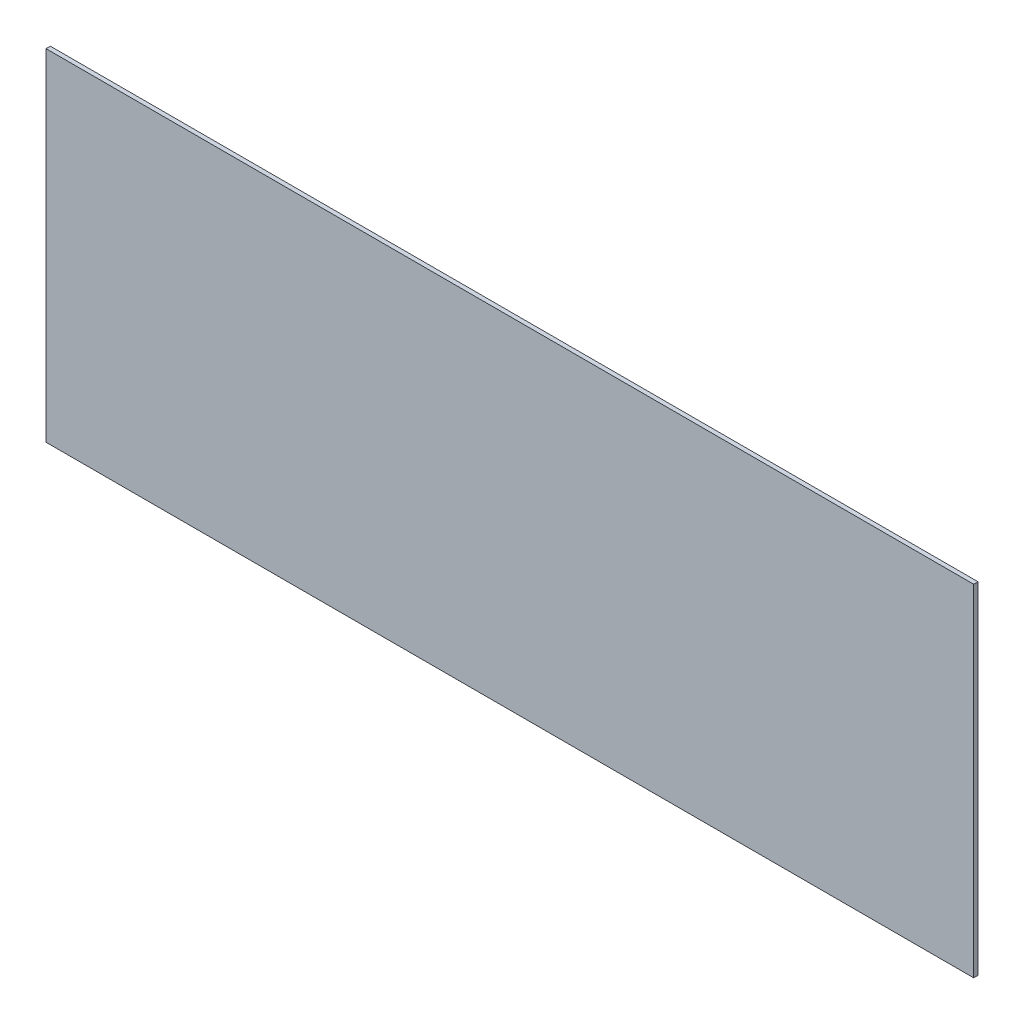
ISO-10303-21;
HEADER;
FILE_DESCRIPTION(('STEP AP214'),'2;1');
FILE_NAME('part.step','',(''),(''),'','','');
FILE_SCHEMA(('AUTOMOTIVE_DESIGN { 1 0 10303 214 1 1 1 1 }'));
ENDSEC;
DATA;
#1=APPLICATION_CONTEXT('core data for automotive mechanical design processes');
#2=APPLICATION_PROTOCOL_DEFINITION('international standard','automotive_design',2000,#1);
#3=PRODUCT_CONTEXT('',#1,'mechanical');
#4=PRODUCT('Part','Part','',(#3));
#5=PRODUCT_RELATED_PRODUCT_CATEGORY('part','',(#4));
#6=PRODUCT_DEFINITION_FORMATION('','',#4);
#7=PRODUCT_DEFINITION_CONTEXT('part definition',#1,'design');
#8=PRODUCT_DEFINITION('design','',#6,#7);
#9=PRODUCT_DEFINITION_SHAPE('','',#8);
#10=(LENGTH_UNIT() NAMED_UNIT(*) SI_UNIT(.MILLI.,.METRE.));
#11=(NAMED_UNIT(*) PLANE_ANGLE_UNIT() SI_UNIT($,.RADIAN.));
#12=(NAMED_UNIT(*) SI_UNIT($,.STERADIAN.) SOLID_ANGLE_UNIT());
#13=UNCERTAINTY_MEASURE_WITH_UNIT(LENGTH_MEASURE(1.E-05),#10,'distance_accuracy_value','');
#14=(GEOMETRIC_REPRESENTATION_CONTEXT(3) GLOBAL_UNCERTAINTY_ASSIGNED_CONTEXT((#13)) GLOBAL_UNIT_ASSIGNED_CONTEXT((#10,
#11,#12)) REPRESENTATION_CONTEXT('',''));
#15=CARTESIAN_POINT('',(0.,0.,0.));
#16=DIRECTION('',(0.,0.,1.));
#17=DIRECTION('',(1.,0.,0.));
#18=AXIS2_PLACEMENT_3D('',#15,#16,#17);
#19=CARTESIAN_POINT('',(-9.52499999999953,-19.0035951574495,2.));
#20=DIRECTION('',(1.,0.,0.));
#21=DIRECTION('',(0.,1.,0.));
#22=AXIS2_PLACEMENT_3D('',#19,#20,#21);
#23=PLANE('',#22);
#24=DIRECTION('',(0.,-1.,0.));
#25=VECTOR('',#24,1.);
#26=CARTESIAN_POINT('',(-9.52499999999953,-19.0035951574495,0.));
#27=LINE('',#26,#25);
#28=CARTESIAN_POINT('',(-9.52500000000003,139.00359515745,0.));
#29=VERTEX_POINT('',#28);
#30=CARTESIAN_POINT('',(-9.52499999999953,-19.0035951574495,0.));
#31=VERTEX_POINT('',#30);
#32=EDGE_CURVE('E95',#29,#31,#27,.T.);
#33=ORIENTED_EDGE('',*,*,#32,.T.);
#34=DIRECTION('',(0.,0.,-1.));
#35=VECTOR('',#34,1.);
#36=CARTESIAN_POINT('',(-9.52499999999953,-19.0035951574495,2.));
#37=LINE('',#36,#35);
#38=CARTESIAN_POINT('',(-9.52499999999953,-19.0035951574495,2.));
#39=VERTEX_POINT('',#38);
#40=EDGE_CURVE('E11',#39,#31,#37,.T.);
#41=ORIENTED_EDGE('',*,*,#40,.F.);
#42=DIRECTION('',(0.,-1.,0.));
#43=VECTOR('',#42,1.);
#44=CARTESIAN_POINT('',(-9.52499999999953,-19.0035951574495,2.));
#45=LINE('',#44,#43);
#46=CARTESIAN_POINT('',(-9.52500000000003,139.00359515745,2.));
#47=VERTEX_POINT('',#46);
#48=EDGE_CURVE('E83',#47,#39,#45,.T.);
#49=ORIENTED_EDGE('',*,*,#48,.F.);
#50=DIRECTION('',(0.,0.,-1.));
#51=VECTOR('',#50,1.);
#52=CARTESIAN_POINT('',(-9.52500000000003,139.00359515745,2.));
#53=LINE('',#52,#51);
#54=EDGE_CURVE('E91',#47,#29,#53,.T.);
#55=ORIENTED_EDGE('',*,*,#54,.T.);
#56=EDGE_LOOP('',(#33,#41,#49,#55));
#57=FACE_BOUND('',#56,.T.);
#58=ADVANCED_FACE('F32',(#57),#23,.F.);
#59=CARTESIAN_POINT('',(420.475,-19.0035951574497,2.));
#60=DIRECTION('',(0.,1.,0.));
#61=DIRECTION('',(-1.,0.,0.));
#62=AXIS2_PLACEMENT_3D('',#59,#60,#61);
#63=PLANE('',#62);
#64=DIRECTION('',(1.,0.,0.));
#65=VECTOR('',#64,1.);
#66=CARTESIAN_POINT('',(420.475,-19.0035951574497,0.));
#67=LINE('',#66,#65);
#68=CARTESIAN_POINT('',(420.475,-19.0035951574497,0.));
#69=VERTEX_POINT('',#68);
#70=EDGE_CURVE('E87',#31,#69,#67,.T.);
#71=ORIENTED_EDGE('',*,*,#70,.T.);
#72=DIRECTION('',(0.,0.,-1.));
#73=VECTOR('',#72,1.);
#74=CARTESIAN_POINT('',(420.475,-19.0035951574497,2.));
#75=LINE('',#74,#73);
#76=CARTESIAN_POINT('',(420.475,-19.0035951574497,2.));
#77=VERTEX_POINT('',#76);
#78=EDGE_CURVE('E40',#77,#69,#75,.T.);
#79=ORIENTED_EDGE('',*,*,#78,.F.);
#80=DIRECTION('',(1.,0.,0.));
#81=VECTOR('',#80,1.);
#82=CARTESIAN_POINT('',(420.475,-19.0035951574497,2.));
#83=LINE('',#82,#81);
#84=EDGE_CURVE('E78',#39,#77,#83,.T.);
#85=ORIENTED_EDGE('',*,*,#84,.F.);
#86=ORIENTED_EDGE('',*,*,#40,.T.);
#87=EDGE_LOOP('',(#71,#79,#85,#86));
#88=FACE_BOUND('',#87,.T.);
#89=ADVANCED_FACE('F86',(#88),#63,.F.);
#90=CARTESIAN_POINT('',(420.475,139.00359515745,2.));
#91=DIRECTION('',(-1.,0.,0.));
#92=DIRECTION('',(0.,-1.,0.));
#93=AXIS2_PLACEMENT_3D('',#90,#91,#92);
#94=PLANE('',#93);
#95=DIRECTION('',(0.,1.,0.));
#96=VECTOR('',#95,1.);
#97=CARTESIAN_POINT('',(420.475,139.00359515745,0.));
#98=LINE('',#97,#96);
#99=CARTESIAN_POINT('',(420.475,139.00359515745,0.));
#100=VERTEX_POINT('',#99);
#101=EDGE_CURVE('E65',#69,#100,#98,.T.);
#102=ORIENTED_EDGE('',*,*,#101,.T.);
#103=DIRECTION('',(0.,0.,-1.));
#104=VECTOR('',#103,1.);
#105=CARTESIAN_POINT('',(420.475,139.00359515745,2.));
#106=LINE('',#105,#104);
#107=CARTESIAN_POINT('',(420.475,139.00359515745,2.));
#108=VERTEX_POINT('',#107);
#109=EDGE_CURVE('E88',#108,#100,#106,.T.);
#110=ORIENTED_EDGE('',*,*,#109,.F.);
#111=DIRECTION('',(0.,1.,0.));
#112=VECTOR('',#111,1.);
#113=CARTESIAN_POINT('',(420.475,139.00359515745,2.));
#114=LINE('',#113,#112);
#115=EDGE_CURVE('E81',#77,#108,#114,.T.);
#116=ORIENTED_EDGE('',*,*,#115,.F.);
#117=ORIENTED_EDGE('',*,*,#78,.T.);
#118=EDGE_LOOP('',(#102,#110,#116,#117));
#119=FACE_BOUND('',#118,.T.);
#120=ADVANCED_FACE('F89',(#119),#94,.F.);
#121=CARTESIAN_POINT('',(-9.52500000000003,139.00359515745,2.));
#122=DIRECTION('',(0.,-1.,0.));
#123=DIRECTION('',(0.,0.,-1.));
#124=AXIS2_PLACEMENT_3D('',#121,#122,#123);
#125=PLANE('',#124);
#126=DIRECTION('',(-1.,0.,0.));
#127=VECTOR('',#126,1.);
#128=CARTESIAN_POINT('',(-9.52500000000003,139.00359515745,0.));
#129=LINE('',#128,#127);
#130=EDGE_CURVE('E71',#100,#29,#129,.T.);
#131=ORIENTED_EDGE('',*,*,#130,.T.);
#132=ORIENTED_EDGE('',*,*,#54,.F.);
#133=DIRECTION('',(-1.,0.,0.));
#134=VECTOR('',#133,1.);
#135=CARTESIAN_POINT('',(-9.52500000000003,139.00359515745,2.));
#136=LINE('',#135,#134);
#137=EDGE_CURVE('E48',#108,#47,#136,.T.);
#138=ORIENTED_EDGE('',*,*,#137,.F.);
#139=ORIENTED_EDGE('',*,*,#109,.T.);
#140=EDGE_LOOP('',(#131,#132,#138,#139));
#141=FACE_BOUND('',#140,.T.);
#142=ADVANCED_FACE('F102',(#141),#125,.F.);
#143=CARTESIAN_POINT('',(0.,0.,2.));
#144=DIRECTION('',(0.,0.,-1.));
#145=DIRECTION('',(-1.,0.,0.));
#146=AXIS2_PLACEMENT_3D('',#143,#144,#145);
#147=PLANE('',#146);
#148=ORIENTED_EDGE('',*,*,#48,.T.);
#149=ORIENTED_EDGE('',*,*,#84,.T.);
#150=ORIENTED_EDGE('',*,*,#115,.T.);
#151=ORIENTED_EDGE('',*,*,#137,.T.);
#152=EDGE_LOOP('',(#148,#149,#150,#151));
#153=FACE_BOUND('',#152,.T.);
#154=ADVANCED_FACE('F79',(#153),#147,.F.);
#155=CARTESIAN_POINT('',(0.,0.,0.));
#156=DIRECTION('',(0.,0.,-1.));
#157=DIRECTION('',(-1.,0.,0.));
#158=AXIS2_PLACEMENT_3D('',#155,#156,#157);
#159=PLANE('',#158);
#160=ORIENTED_EDGE('',*,*,#32,.F.);
#161=ORIENTED_EDGE('',*,*,#130,.F.);
#162=ORIENTED_EDGE('',*,*,#101,.F.);
#163=ORIENTED_EDGE('',*,*,#70,.F.);
#164=EDGE_LOOP('',(#160,#161,#162,#163));
#165=FACE_BOUND('',#164,.T.);
#166=ADVANCED_FACE('F105',(#165),#159,.T.);
#167=CLOSED_SHELL('',(#58,#89,#120,#142,#154,#166));
#168=MANIFOLD_SOLID_BREP('B2',#167);
#169=ADVANCED_BREP_SHAPE_REPRESENTATION('',(#18,#168),#14);
#170=SHAPE_DEFINITION_REPRESENTATION(#9,#169);
ENDSEC;
END-ISO-10303-21;
